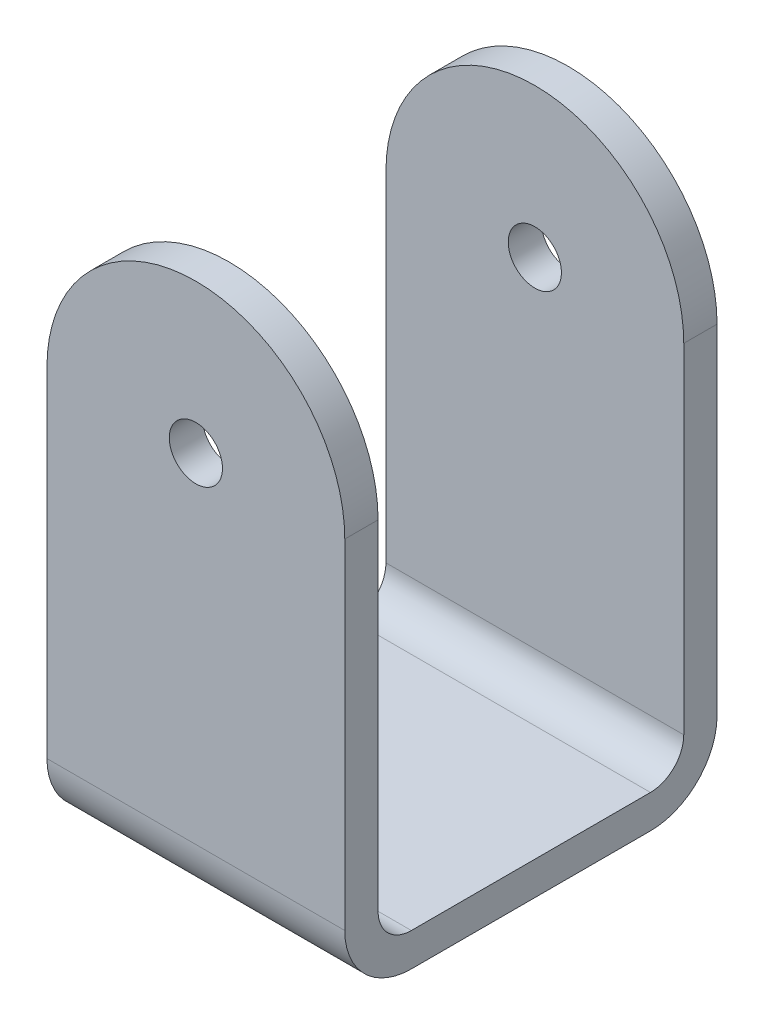
ISO-10303-21;
HEADER;
FILE_DESCRIPTION(('STEP AP214'),'2;1');
FILE_NAME('part.step','',(''),(''),'','','');
FILE_SCHEMA(('AUTOMOTIVE_DESIGN { 1 0 10303 214 1 1 1 1 }'));
ENDSEC;
DATA;
#1=APPLICATION_CONTEXT('core data for automotive mechanical design processes');
#2=APPLICATION_PROTOCOL_DEFINITION('international standard','automotive_design',2000,#1);
#3=PRODUCT_CONTEXT('',#1,'mechanical');
#4=PRODUCT('Part','Part','',(#3));
#5=PRODUCT_RELATED_PRODUCT_CATEGORY('part','',(#4));
#6=PRODUCT_DEFINITION_FORMATION('','',#4);
#7=PRODUCT_DEFINITION_CONTEXT('part definition',#1,'design');
#8=PRODUCT_DEFINITION('design','',#6,#7);
#9=PRODUCT_DEFINITION_SHAPE('','',#8);
#10=(LENGTH_UNIT() NAMED_UNIT(*) SI_UNIT(.MILLI.,.METRE.));
#11=(NAMED_UNIT(*) PLANE_ANGLE_UNIT() SI_UNIT($,.RADIAN.));
#12=(NAMED_UNIT(*) SI_UNIT($,.STERADIAN.) SOLID_ANGLE_UNIT());
#13=UNCERTAINTY_MEASURE_WITH_UNIT(LENGTH_MEASURE(1.E-05),#10,'distance_accuracy_value','');
#14=(GEOMETRIC_REPRESENTATION_CONTEXT(3) GLOBAL_UNCERTAINTY_ASSIGNED_CONTEXT((#13)) GLOBAL_UNIT_ASSIGNED_CONTEXT((#10,
#11,#12)) REPRESENTATION_CONTEXT('',''));
#15=CARTESIAN_POINT('',(0.,0.,0.));
#16=DIRECTION('',(0.,0.,1.));
#17=DIRECTION('',(1.,0.,0.));
#18=AXIS2_PLACEMENT_3D('',#15,#16,#17);
#19=CARTESIAN_POINT('',(0.,0.,44.45));
#20=DIRECTION('',(0.,0.,-1.));
#21=DIRECTION('',(-1.,0.,0.));
#22=AXIS2_PLACEMENT_3D('',#19,#20,#21);
#23=CYLINDRICAL_SURFACE('',#22,35.56);
#24=DIRECTION('',(0.,0.,-1.));
#25=VECTOR('',#24,1.);
#26=CARTESIAN_POINT('',(35.56,0.,44.45));
#27=LINE('',#26,#25);
#28=CARTESIAN_POINT('',(35.56,0.,44.45));
#29=VERTEX_POINT('',#28);
#30=CARTESIAN_POINT('',(35.56,0.,36.4998));
#31=VERTEX_POINT('',#30);
#32=EDGE_CURVE('E254',#29,#31,#27,.T.);
#33=ORIENTED_EDGE('',*,*,#32,.T.);
#34=CARTESIAN_POINT('',(0.,0.,36.4998));
#35=DIRECTION('',(0.,0.,1.));
#36=DIRECTION('',(0.,-1.,0.));
#37=AXIS2_PLACEMENT_3D('',#34,#35,#36);
#38=CIRCLE('',#37,35.56);
#39=CARTESIAN_POINT('',(-35.56,0.,36.4998));
#40=VERTEX_POINT('',#39);
#41=EDGE_CURVE('E222',#31,#40,#38,.T.);
#42=ORIENTED_EDGE('',*,*,#41,.T.);
#43=DIRECTION('',(0.,0.,-1.));
#44=VECTOR('',#43,1.);
#45=CARTESIAN_POINT('',(-35.56,0.,44.45));
#46=LINE('',#45,#44);
#47=CARTESIAN_POINT('',(-35.56,0.,44.45));
#48=VERTEX_POINT('',#47);
#49=EDGE_CURVE('E177',#48,#40,#46,.T.);
#50=ORIENTED_EDGE('',*,*,#49,.F.);
#51=CARTESIAN_POINT('',(0.,0.,44.45));
#52=DIRECTION('',(0.,0.,1.));
#53=DIRECTION('',(1.,0.,0.));
#54=AXIS2_PLACEMENT_3D('',#51,#52,#53);
#55=CIRCLE('',#54,35.56);
#56=EDGE_CURVE('E234',#29,#48,#55,.T.);
#57=ORIENTED_EDGE('',*,*,#56,.F.);
#58=EDGE_LOOP('',(#33,#42,#50,#57));
#59=FACE_BOUND('',#58,.T.);
#60=ADVANCED_FACE('F59',(#59),#23,.T.);
#61=CARTESIAN_POINT('',(0.,0.,44.45));
#62=DIRECTION('',(0.,0.,-1.));
#63=DIRECTION('',(-1.,0.,0.));
#64=AXIS2_PLACEMENT_3D('',#61,#62,#63);
#65=CYLINDRICAL_SURFACE('',#64,6.35);
#66=CARTESIAN_POINT('',(0.,0.,36.4998));
#67=DIRECTION('',(0.,0.,1.));
#68=DIRECTION('',(0.,-1.,0.));
#69=AXIS2_PLACEMENT_3D('',#66,#67,#68);
#70=CIRCLE('',#69,6.35);
#71=CARTESIAN_POINT('',(0.,-6.35,36.4998));
#72=VERTEX_POINT('',#71);
#73=EDGE_CURVE('E221',#72,#72,#70,.T.);
#74=ORIENTED_EDGE('',*,*,#73,.F.);
#75=EDGE_LOOP('',(#74));
#76=FACE_BOUND('',#75,.T.);
#77=CARTESIAN_POINT('',(0.,0.,44.45));
#78=DIRECTION('',(0.,0.,1.));
#79=DIRECTION('',(1.,0.,0.));
#80=AXIS2_PLACEMENT_3D('',#77,#78,#79);
#81=CIRCLE('',#80,6.35);
#82=CARTESIAN_POINT('',(6.35,0.,44.45));
#83=VERTEX_POINT('',#82);
#84=EDGE_CURVE('E226',#83,#83,#81,.T.);
#85=ORIENTED_EDGE('',*,*,#84,.T.);
#86=EDGE_LOOP('',(#85));
#87=FACE_BOUND('',#86,.T.);
#88=ADVANCED_FACE('F415',(#76,#87),#65,.F.);
#89=CARTESIAN_POINT('',(0.,0.,44.45));
#90=DIRECTION('',(0.,0.,1.));
#91=DIRECTION('',(1.,0.,0.));
#92=AXIS2_PLACEMENT_3D('',#89,#90,#91);
#93=PLANE('',#92);
#94=DIRECTION('',(0.,-1.,0.));
#95=VECTOR('',#94,1.);
#96=CARTESIAN_POINT('',(-35.56,0.,44.45));
#97=LINE('',#96,#95);
#98=CARTESIAN_POINT('',(-35.56,-80.9498,44.45));
#99=VERTEX_POINT('',#98);
#100=EDGE_CURVE('E238',#48,#99,#97,.T.);
#101=ORIENTED_EDGE('',*,*,#100,.T.);
#102=DIRECTION('',(1.,0.,0.));
#103=VECTOR('',#102,1.);
#104=CARTESIAN_POINT('',(35.56,-80.9498,44.45));
#105=LINE('',#104,#103);
#106=CARTESIAN_POINT('',(35.56,-80.9498,44.45));
#107=VERTEX_POINT('',#106);
#108=EDGE_CURVE('E13',#99,#107,#105,.T.);
#109=ORIENTED_EDGE('',*,*,#108,.T.);
#110=DIRECTION('',(0.,1.,0.));
#111=VECTOR('',#110,1.);
#112=CARTESIAN_POINT('',(35.56,-96.8502,44.45));
#113=LINE('',#112,#111);
#114=EDGE_CURVE('E242',#107,#29,#113,.T.);
#115=ORIENTED_EDGE('',*,*,#114,.T.);
#116=ORIENTED_EDGE('',*,*,#56,.T.);
#117=EDGE_LOOP('',(#101,#109,#115,#116));
#118=FACE_BOUND('',#117,.T.);
#119=ORIENTED_EDGE('',*,*,#84,.F.);
#120=EDGE_LOOP('',(#119));
#121=FACE_BOUND('',#120,.T.);
#122=ADVANCED_FACE('F406',(#118,#121),#93,.T.);
#123=CARTESIAN_POINT('',(0.,0.,-44.45));
#124=DIRECTION('',(0.,0.,1.));
#125=DIRECTION('',(1.,0.,0.));
#126=AXIS2_PLACEMENT_3D('',#123,#124,#125);
#127=PLANE('',#126);
#128=DIRECTION('',(0.,1.,0.));
#129=VECTOR('',#128,1.);
#130=CARTESIAN_POINT('',(35.56,-96.8502,-44.45));
#131=LINE('',#130,#129);
#132=CARTESIAN_POINT('',(35.56,-80.9498,-44.45));
#133=VERTEX_POINT('',#132);
#134=CARTESIAN_POINT('',(35.56,0.,-44.45));
#135=VERTEX_POINT('',#134);
#136=EDGE_CURVE('E239',#133,#135,#131,.T.);
#137=ORIENTED_EDGE('',*,*,#136,.F.);
#138=DIRECTION('',(1.,0.,0.));
#139=VECTOR('',#138,1.);
#140=CARTESIAN_POINT('',(0.,-80.9498,-44.45));
#141=LINE('',#140,#139);
#142=CARTESIAN_POINT('',(-35.56,-80.9498,-44.45));
#143=VERTEX_POINT('',#142);
#144=EDGE_CURVE('E83',#133,#143,#141,.F.);
#145=ORIENTED_EDGE('',*,*,#144,.T.);
#146=DIRECTION('',(0.,-1.,0.));
#147=VECTOR('',#146,1.);
#148=CARTESIAN_POINT('',(-35.56,0.,-44.45));
#149=LINE('',#148,#147);
#150=CARTESIAN_POINT('',(-35.56,0.,-44.45));
#151=VERTEX_POINT('',#150);
#152=EDGE_CURVE('E249',#151,#143,#149,.T.);
#153=ORIENTED_EDGE('',*,*,#152,.F.);
#154=CARTESIAN_POINT('',(0.,0.,-44.45));
#155=DIRECTION('',(0.,0.,1.));
#156=DIRECTION('',(1.,0.,0.));
#157=AXIS2_PLACEMENT_3D('',#154,#155,#156);
#158=CIRCLE('',#157,35.56);
#159=EDGE_CURVE('E230',#135,#151,#158,.T.);
#160=ORIENTED_EDGE('',*,*,#159,.F.);
#161=EDGE_LOOP('',(#137,#145,#153,#160));
#162=FACE_BOUND('',#161,.T.);
#163=CARTESIAN_POINT('',(0.,0.,-44.45));
#164=DIRECTION('',(0.,0.,1.));
#165=DIRECTION('',(1.,0.,0.));
#166=AXIS2_PLACEMENT_3D('',#163,#164,#165);
#167=CIRCLE('',#166,6.35);
#168=CARTESIAN_POINT('',(6.35,0.,-44.45));
#169=VERTEX_POINT('',#168);
#170=EDGE_CURVE('E225',#169,#169,#167,.T.);
#171=ORIENTED_EDGE('',*,*,#170,.T.);
#172=EDGE_LOOP('',(#171));
#173=FACE_BOUND('',#172,.T.);
#174=ADVANCED_FACE('F307',(#162,#173),#127,.F.);
#175=CARTESIAN_POINT('',(-35.56,0.,-36.4998));
#176=VERTEX_POINT('',#175);
#177=EDGE_CURVE('E266',#176,#151,#46,.T.);
#178=ORIENTED_EDGE('',*,*,#177,.F.);
#179=CARTESIAN_POINT('',(0.,0.,-36.4998));
#180=DIRECTION('',(0.,0.,-1.));
#181=DIRECTION('',(0.,1.,0.));
#182=AXIS2_PLACEMENT_3D('',#179,#180,#181);
#183=CIRCLE('',#182,35.56);
#184=CARTESIAN_POINT('',(35.56,0.,-36.4998));
#185=VERTEX_POINT('',#184);
#186=EDGE_CURVE('E217',#176,#185,#183,.T.);
#187=ORIENTED_EDGE('',*,*,#186,.T.);
#188=EDGE_CURVE('E245',#185,#135,#27,.T.);
#189=ORIENTED_EDGE('',*,*,#188,.T.);
#190=ORIENTED_EDGE('',*,*,#159,.T.);
#191=EDGE_LOOP('',(#178,#187,#189,#190));
#192=FACE_BOUND('',#191,.T.);
#193=ADVANCED_FACE('F311',(#192),#23,.T.);
#194=CARTESIAN_POINT('',(-35.56,0.,44.45));
#195=DIRECTION('',(1.,0.,0.));
#196=DIRECTION('',(0.,1.,0.));
#197=AXIS2_PLACEMENT_3D('',#194,#195,#196);
#198=PLANE('',#197);
#199=ORIENTED_EDGE('',*,*,#152,.T.);
#200=CARTESIAN_POINT('',(-35.56,-80.9498,-28.5496));
#201=DIRECTION('',(1.,0.,0.));
#202=DIRECTION('',(0.,1.,0.));
#203=AXIS2_PLACEMENT_3D('',#200,#201,#202);
#204=CIRCLE('',#203,15.9004);
#205=CARTESIAN_POINT('',(-35.56,-96.8502,-28.5496));
#206=VERTEX_POINT('',#205);
#207=EDGE_CURVE('E68',#143,#206,#204,.F.);
#208=ORIENTED_EDGE('',*,*,#207,.T.);
#209=DIRECTION('',(0.,0.,-1.));
#210=VECTOR('',#209,1.);
#211=CARTESIAN_POINT('',(-35.56,-96.8502,44.45));
#212=LINE('',#211,#210);
#213=CARTESIAN_POINT('',(-35.56,-96.8502,28.5496));
#214=VERTEX_POINT('',#213);
#215=EDGE_CURVE('E262',#214,#206,#212,.T.);
#216=ORIENTED_EDGE('',*,*,#215,.F.);
#217=CARTESIAN_POINT('',(-35.56,-80.9498,28.5496));
#218=DIRECTION('',(1.,0.,0.));
#219=DIRECTION('',(0.,1.,0.));
#220=AXIS2_PLACEMENT_3D('',#217,#218,#219);
#221=CIRCLE('',#220,15.9004);
#222=EDGE_CURVE('E75',#214,#99,#221,.F.);
#223=ORIENTED_EDGE('',*,*,#222,.T.);
#224=ORIENTED_EDGE('',*,*,#100,.F.);
#225=ORIENTED_EDGE('',*,*,#49,.T.);
#226=DIRECTION('',(0.,-1.,0.));
#227=VECTOR('',#226,1.);
#228=CARTESIAN_POINT('',(-35.56,50.8,36.4998));
#229=LINE('',#228,#227);
#230=CARTESIAN_POINT('',(-35.56,-80.9497999999999,36.4998));
#231=VERTEX_POINT('',#230);
#232=EDGE_CURVE('E155',#40,#231,#229,.T.);
#233=ORIENTED_EDGE('',*,*,#232,.T.);
#234=CARTESIAN_POINT('',(-35.56,-80.9498,28.5496));
#235=DIRECTION('',(1.,0.,0.));
#236=DIRECTION('',(0.,1.,0.));
#237=AXIS2_PLACEMENT_3D('',#234,#235,#236);
#238=CIRCLE('',#237,7.9502);
#239=CARTESIAN_POINT('',(-35.56,-88.9,28.5495999999999));
#240=VERTEX_POINT('',#239);
#241=EDGE_CURVE('E167',#231,#240,#238,.T.);
#242=ORIENTED_EDGE('',*,*,#241,.T.);
#243=DIRECTION('',(0.,0.,-1.));
#244=VECTOR('',#243,1.);
#245=CARTESIAN_POINT('',(-35.56,-88.9,28.5495999999999));
#246=LINE('',#245,#244);
#247=CARTESIAN_POINT('',(-35.56,-88.9,-28.5496));
#248=VERTEX_POINT('',#247);
#249=EDGE_CURVE('E172',#240,#248,#246,.T.);
#250=ORIENTED_EDGE('',*,*,#249,.T.);
#251=CARTESIAN_POINT('',(-35.56,-80.9498,-28.5496));
#252=DIRECTION('',(1.,0.,0.));
#253=DIRECTION('',(0.,1.,0.));
#254=AXIS2_PLACEMENT_3D('',#251,#252,#253);
#255=CIRCLE('',#254,7.9502);
#256=CARTESIAN_POINT('',(-35.56,-80.9497999999999,-36.4998));
#257=VERTEX_POINT('',#256);
#258=EDGE_CURVE('E189',#248,#257,#255,.T.);
#259=ORIENTED_EDGE('',*,*,#258,.T.);
#260=DIRECTION('',(0.,1.,0.));
#261=VECTOR('',#260,1.);
#262=CARTESIAN_POINT('',(-35.56,50.8,-36.4998));
#263=LINE('',#262,#261);
#264=EDGE_CURVE('E164',#257,#176,#263,.T.);
#265=ORIENTED_EDGE('',*,*,#264,.T.);
#266=ORIENTED_EDGE('',*,*,#177,.T.);
#267=EDGE_LOOP('',(#199,#208,#216,#223,#224,#225,#233,#242,#250,#259,#265,#266));
#268=FACE_BOUND('',#267,.T.);
#269=ADVANCED_FACE('F175',(#268),#198,.F.);
#270=CARTESIAN_POINT('',(-35.56,-96.8502,44.45));
#271=DIRECTION('',(0.,1.,0.));
#272=DIRECTION('',(0.,0.,1.));
#273=AXIS2_PLACEMENT_3D('',#270,#271,#272);
#274=PLANE('',#273);
#275=ORIENTED_EDGE('',*,*,#215,.T.);
#276=DIRECTION('',(1.,0.,0.));
#277=VECTOR('',#276,1.);
#278=CARTESIAN_POINT('',(-35.56,-96.8502,-28.5496));
#279=LINE('',#278,#277);
#280=CARTESIAN_POINT('',(35.56,-96.8502,-28.5496));
#281=VERTEX_POINT('',#280);
#282=EDGE_CURVE('E278',#206,#281,#279,.T.);
#283=ORIENTED_EDGE('',*,*,#282,.T.);
#284=DIRECTION('',(0.,0.,-1.));
#285=VECTOR('',#284,1.);
#286=CARTESIAN_POINT('',(35.56,-96.8502,44.45));
#287=LINE('',#286,#285);
#288=CARTESIAN_POINT('',(35.56,-96.8502,28.5496));
#289=VERTEX_POINT('',#288);
#290=EDGE_CURVE('E258',#289,#281,#287,.T.);
#291=ORIENTED_EDGE('',*,*,#290,.F.);
#292=DIRECTION('',(1.,0.,0.));
#293=VECTOR('',#292,1.);
#294=CARTESIAN_POINT('',(-35.56,-96.8502,28.5496));
#295=LINE('',#294,#293);
#296=EDGE_CURVE('E269',#289,#214,#295,.F.);
#297=ORIENTED_EDGE('',*,*,#296,.T.);
#298=EDGE_LOOP('',(#275,#283,#291,#297));
#299=FACE_BOUND('',#298,.T.);
#300=ADVANCED_FACE('F298',(#299),#274,.F.);
#301=CARTESIAN_POINT('',(35.56,-96.8502,44.45));
#302=DIRECTION('',(-1.,0.,0.));
#303=DIRECTION('',(0.,-1.,0.));
#304=AXIS2_PLACEMENT_3D('',#301,#302,#303);
#305=PLANE('',#304);
#306=ORIENTED_EDGE('',*,*,#290,.T.);
#307=CARTESIAN_POINT('',(35.56,-80.9498,-28.5496));
#308=DIRECTION('',(-1.,0.,0.));
#309=DIRECTION('',(0.,-1.,0.));
#310=AXIS2_PLACEMENT_3D('',#307,#308,#309);
#311=CIRCLE('',#310,15.9004);
#312=EDGE_CURVE('E285',#281,#133,#311,.F.);
#313=ORIENTED_EDGE('',*,*,#312,.T.);
#314=ORIENTED_EDGE('',*,*,#136,.T.);
#315=ORIENTED_EDGE('',*,*,#188,.F.);
#316=DIRECTION('',(0.,1.,0.));
#317=VECTOR('',#316,1.);
#318=CARTESIAN_POINT('',(35.56,50.8,-36.4998));
#319=LINE('',#318,#317);
#320=CARTESIAN_POINT('',(35.56,-80.9497999999999,-36.4998));
#321=VERTEX_POINT('',#320);
#322=EDGE_CURVE('E179',#321,#185,#319,.T.);
#323=ORIENTED_EDGE('',*,*,#322,.F.);
#324=CARTESIAN_POINT('',(35.56,-80.9498,-28.5496));
#325=DIRECTION('',(1.,0.,0.));
#326=DIRECTION('',(0.,1.,0.));
#327=AXIS2_PLACEMENT_3D('',#324,#325,#326);
#328=CIRCLE('',#327,7.9502);
#329=CARTESIAN_POINT('',(35.56,-88.9,-28.5496));
#330=VERTEX_POINT('',#329);
#331=EDGE_CURVE('E184',#330,#321,#328,.T.);
#332=ORIENTED_EDGE('',*,*,#331,.F.);
#333=DIRECTION('',(0.,0.,-1.));
#334=VECTOR('',#333,1.);
#335=CARTESIAN_POINT('',(35.56,-88.9,28.5495999999999));
#336=LINE('',#335,#334);
#337=CARTESIAN_POINT('',(35.56,-88.9,28.5495999999999));
#338=VERTEX_POINT('',#337);
#339=EDGE_CURVE('E201',#338,#330,#336,.T.);
#340=ORIENTED_EDGE('',*,*,#339,.F.);
#341=CARTESIAN_POINT('',(35.56,-80.9498,28.5496));
#342=DIRECTION('',(1.,0.,0.));
#343=DIRECTION('',(0.,1.,0.));
#344=AXIS2_PLACEMENT_3D('',#341,#342,#343);
#345=CIRCLE('',#344,7.9502);
#346=CARTESIAN_POINT('',(35.56,-80.9497999999999,36.4998));
#347=VERTEX_POINT('',#346);
#348=EDGE_CURVE('E198',#347,#338,#345,.T.);
#349=ORIENTED_EDGE('',*,*,#348,.F.);
#350=DIRECTION('',(0.,-1.,0.));
#351=VECTOR('',#350,1.);
#352=CARTESIAN_POINT('',(35.56,50.8,36.4998));
#353=LINE('',#352,#351);
#354=EDGE_CURVE('E158',#31,#347,#353,.T.);
#355=ORIENTED_EDGE('',*,*,#354,.F.);
#356=ORIENTED_EDGE('',*,*,#32,.F.);
#357=ORIENTED_EDGE('',*,*,#114,.F.);
#358=CARTESIAN_POINT('',(35.56,-80.9498,28.5496));
#359=DIRECTION('',(-1.,0.,0.));
#360=DIRECTION('',(0.,-1.,0.));
#361=AXIS2_PLACEMENT_3D('',#358,#359,#360);
#362=CIRCLE('',#361,15.9004);
#363=EDGE_CURVE('E282',#107,#289,#362,.F.);
#364=ORIENTED_EDGE('',*,*,#363,.T.);
#365=EDGE_LOOP('',(#306,#313,#314,#315,#323,#332,#340,#349,#355,#356,#357,#364));
#366=FACE_BOUND('',#365,.T.);
#367=ADVANCED_FACE('F303',(#366),#305,.F.);
#368=CARTESIAN_POINT('',(0.,0.,-36.4998));
#369=DIRECTION('',(0.,0.,-1.));
#370=DIRECTION('',(0.,1.,0.));
#371=AXIS2_PLACEMENT_3D('',#368,#369,#370);
#372=CIRCLE('',#371,6.35);
#373=CARTESIAN_POINT('',(0.,6.35,-36.4998));
#374=VERTEX_POINT('',#373);
#375=EDGE_CURVE('E211',#374,#374,#372,.T.);
#376=ORIENTED_EDGE('',*,*,#375,.F.);
#377=EDGE_LOOP('',(#376));
#378=FACE_BOUND('',#377,.T.);
#379=ORIENTED_EDGE('',*,*,#170,.F.);
#380=EDGE_LOOP('',(#379));
#381=FACE_BOUND('',#380,.T.);
#382=ADVANCED_FACE('F422',(#378,#381),#65,.F.);
#383=CARTESIAN_POINT('',(-35.56,50.8,36.4998));
#384=DIRECTION('',(0.,0.,1.));
#385=DIRECTION('',(0.,-1.,0.));
#386=AXIS2_PLACEMENT_3D('',#383,#384,#385);
#387=PLANE('',#386);
#388=ORIENTED_EDGE('',*,*,#73,.T.);
#389=EDGE_LOOP('',(#388));
#390=FACE_BOUND('',#389,.T.);
#391=ORIENTED_EDGE('',*,*,#354,.T.);
#392=DIRECTION('',(1.,0.,0.));
#393=VECTOR('',#392,1.);
#394=CARTESIAN_POINT('',(-35.56,-80.9497999999999,36.4998));
#395=LINE('',#394,#393);
#396=EDGE_CURVE('E151',#231,#347,#395,.T.);
#397=ORIENTED_EDGE('',*,*,#396,.F.);
#398=ORIENTED_EDGE('',*,*,#232,.F.);
#399=ORIENTED_EDGE('',*,*,#41,.F.);
#400=EDGE_LOOP('',(#391,#397,#398,#399));
#401=FACE_BOUND('',#400,.T.);
#402=ADVANCED_FACE('F153',(#390,#401),#387,.F.);
#403=CARTESIAN_POINT('',(-35.56,50.8,-36.4998));
#404=DIRECTION('',(0.,0.,-1.));
#405=DIRECTION('',(0.,1.,0.));
#406=AXIS2_PLACEMENT_3D('',#403,#404,#405);
#407=PLANE('',#406);
#408=ORIENTED_EDGE('',*,*,#375,.T.);
#409=EDGE_LOOP('',(#408));
#410=FACE_BOUND('',#409,.T.);
#411=ORIENTED_EDGE('',*,*,#264,.F.);
#412=DIRECTION('',(1.,0.,0.));
#413=VECTOR('',#412,1.);
#414=CARTESIAN_POINT('',(-35.56,-80.9497999999999,-36.4998));
#415=LINE('',#414,#413);
#416=EDGE_CURVE('E208',#257,#321,#415,.T.);
#417=ORIENTED_EDGE('',*,*,#416,.T.);
#418=ORIENTED_EDGE('',*,*,#322,.T.);
#419=ORIENTED_EDGE('',*,*,#186,.F.);
#420=EDGE_LOOP('',(#411,#417,#418,#419));
#421=FACE_BOUND('',#420,.T.);
#422=ADVANCED_FACE('F394',(#410,#421),#407,.F.);
#423=CARTESIAN_POINT('',(-35.56,-80.9498,-28.5496));
#424=DIRECTION('',(1.,0.,0.));
#425=DIRECTION('',(0.,1.,0.));
#426=AXIS2_PLACEMENT_3D('',#423,#424,#425);
#427=CYLINDRICAL_SURFACE('',#426,7.9502);
#428=ORIENTED_EDGE('',*,*,#331,.T.);
#429=ORIENTED_EDGE('',*,*,#416,.F.);
#430=ORIENTED_EDGE('',*,*,#258,.F.);
#431=DIRECTION('',(1.,0.,0.));
#432=VECTOR('',#431,1.);
#433=CARTESIAN_POINT('',(-35.56,-88.9,-28.5496));
#434=LINE('',#433,#432);
#435=EDGE_CURVE('E212',#248,#330,#434,.T.);
#436=ORIENTED_EDGE('',*,*,#435,.T.);
#437=EDGE_LOOP('',(#428,#429,#430,#436));
#438=FACE_BOUND('',#437,.T.);
#439=ADVANCED_FACE('F398',(#438),#427,.F.);
#440=CARTESIAN_POINT('',(-35.56,-88.9,28.5495999999999));
#441=DIRECTION('',(0.,-1.,0.));
#442=DIRECTION('',(1.,0.,0.));
#443=AXIS2_PLACEMENT_3D('',#440,#441,#442);
#444=PLANE('',#443);
#445=ORIENTED_EDGE('',*,*,#339,.T.);
#446=ORIENTED_EDGE('',*,*,#435,.F.);
#447=ORIENTED_EDGE('',*,*,#249,.F.);
#448=DIRECTION('',(1.,0.,0.));
#449=VECTOR('',#448,1.);
#450=CARTESIAN_POINT('',(-35.56,-88.9,28.5495999999999));
#451=LINE('',#450,#449);
#452=EDGE_CURVE('E163',#240,#338,#451,.T.);
#453=ORIENTED_EDGE('',*,*,#452,.T.);
#454=EDGE_LOOP('',(#445,#446,#447,#453));
#455=FACE_BOUND('',#454,.T.);
#456=ADVANCED_FACE('F400',(#455),#444,.F.);
#457=CARTESIAN_POINT('',(-35.56,-80.9498,28.5496));
#458=DIRECTION('',(1.,0.,0.));
#459=DIRECTION('',(0.,1.,0.));
#460=AXIS2_PLACEMENT_3D('',#457,#458,#459);
#461=CYLINDRICAL_SURFACE('',#460,7.9502);
#462=ORIENTED_EDGE('',*,*,#348,.T.);
#463=ORIENTED_EDGE('',*,*,#452,.F.);
#464=ORIENTED_EDGE('',*,*,#241,.F.);
#465=ORIENTED_EDGE('',*,*,#396,.T.);
#466=EDGE_LOOP('',(#462,#463,#464,#465));
#467=FACE_BOUND('',#466,.T.);
#468=ADVANCED_FACE('F168',(#467),#461,.F.);
#469=CARTESIAN_POINT('',(-35.56,-80.9498,-28.5496));
#470=DIRECTION('',(1.,0.,0.));
#471=DIRECTION('',(0.,0.,-1.));
#472=AXIS2_PLACEMENT_3D('',#469,#470,#471);
#473=CYLINDRICAL_SURFACE('',#472,15.9004);
#474=ORIENTED_EDGE('',*,*,#207,.F.);
#475=ORIENTED_EDGE('',*,*,#144,.F.);
#476=ORIENTED_EDGE('',*,*,#312,.F.);
#477=ORIENTED_EDGE('',*,*,#282,.F.);
#478=EDGE_LOOP('',(#474,#475,#476,#477));
#479=FACE_BOUND('',#478,.T.);
#480=ADVANCED_FACE('F301',(#479),#473,.T.);
#481=CARTESIAN_POINT('',(0.,-80.9498,28.5496));
#482=DIRECTION('',(-1.,0.,0.));
#483=DIRECTION('',(0.,0.,1.));
#484=AXIS2_PLACEMENT_3D('',#481,#482,#483);
#485=CYLINDRICAL_SURFACE('',#484,15.9004);
#486=ORIENTED_EDGE('',*,*,#222,.F.);
#487=ORIENTED_EDGE('',*,*,#296,.F.);
#488=ORIENTED_EDGE('',*,*,#363,.F.);
#489=ORIENTED_EDGE('',*,*,#108,.F.);
#490=EDGE_LOOP('',(#486,#487,#488,#489));
#491=FACE_BOUND('',#490,.T.);
#492=ADVANCED_FACE('F61',(#491),#485,.T.);
#493=CLOSED_SHELL('',(#60,#88,#122,#174,#193,#269,#300,#367,#382,#402,#422,#439,#456,#468,#480,#492));
#494=MANIFOLD_SOLID_BREP('B2',#493);
#495=ADVANCED_BREP_SHAPE_REPRESENTATION('',(#18,#494),#14);
#496=SHAPE_DEFINITION_REPRESENTATION(#9,#495);
ENDSEC;
END-ISO-10303-21;
